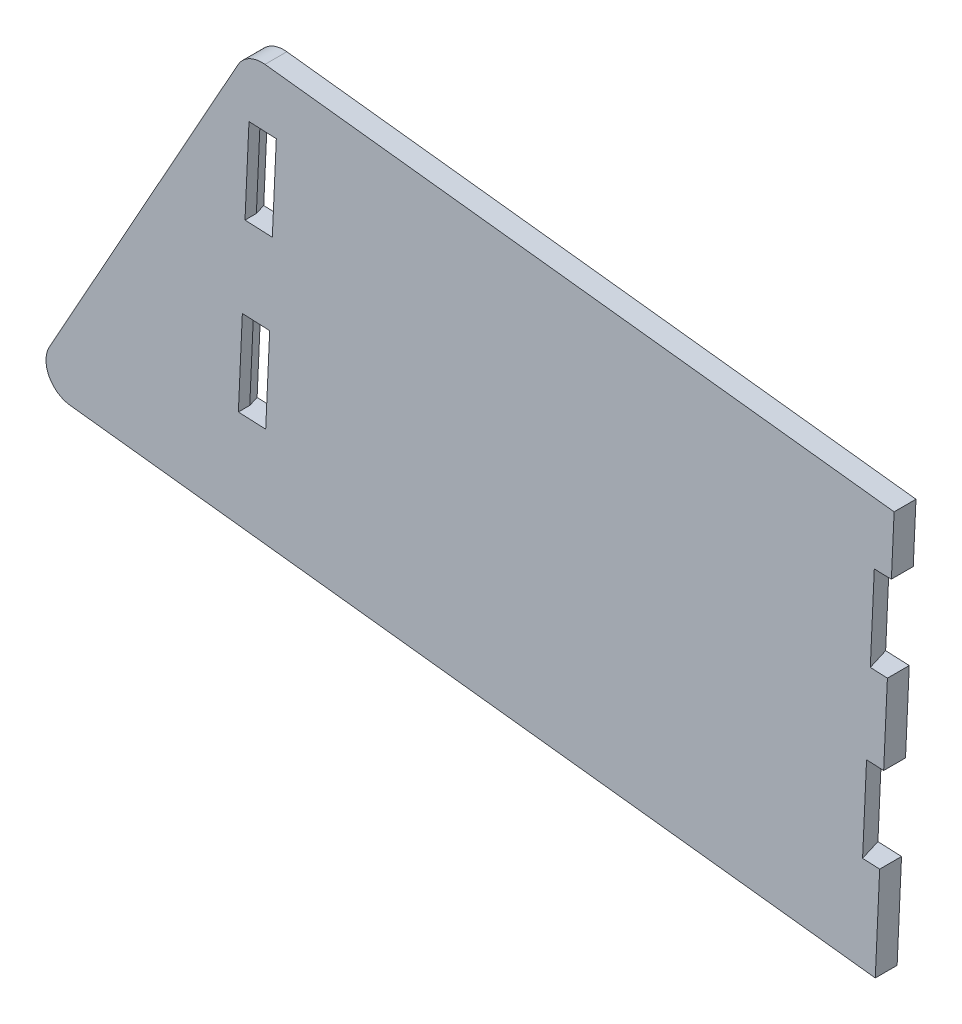
ISO-10303-21;
HEADER;
FILE_DESCRIPTION(('STEP AP214'),'2;1');
FILE_NAME('part.step','',(''),(''),'','','');
FILE_SCHEMA(('AUTOMOTIVE_DESIGN { 1 0 10303 214 1 1 1 1 }'));
ENDSEC;
DATA;
#1=APPLICATION_CONTEXT('core data for automotive mechanical design processes');
#2=APPLICATION_PROTOCOL_DEFINITION('international standard','automotive_design',2000,#1);
#3=PRODUCT_CONTEXT('',#1,'mechanical');
#4=PRODUCT('Part','Part','',(#3));
#5=PRODUCT_RELATED_PRODUCT_CATEGORY('part','',(#4));
#6=PRODUCT_DEFINITION_FORMATION('','',#4);
#7=PRODUCT_DEFINITION_CONTEXT('part definition',#1,'design');
#8=PRODUCT_DEFINITION('design','',#6,#7);
#9=PRODUCT_DEFINITION_SHAPE('','',#8);
#10=(LENGTH_UNIT() NAMED_UNIT(*) SI_UNIT(.MILLI.,.METRE.));
#11=(NAMED_UNIT(*) PLANE_ANGLE_UNIT() SI_UNIT($,.RADIAN.));
#12=(NAMED_UNIT(*) SI_UNIT($,.STERADIAN.) SOLID_ANGLE_UNIT());
#13=UNCERTAINTY_MEASURE_WITH_UNIT(LENGTH_MEASURE(1.E-05),#10,'distance_accuracy_value','');
#14=(GEOMETRIC_REPRESENTATION_CONTEXT(3) GLOBAL_UNCERTAINTY_ASSIGNED_CONTEXT((#13)) GLOBAL_UNIT_ASSIGNED_CONTEXT((#10,
#11,#12)) REPRESENTATION_CONTEXT('',''));
#15=CARTESIAN_POINT('',(0.,0.,0.));
#16=DIRECTION('',(0.,0.,1.));
#17=DIRECTION('',(1.,0.,0.));
#18=AXIS2_PLACEMENT_3D('',#15,#16,#17);
#19=CARTESIAN_POINT('',(118.450220219709,62.2675177030051,4.));
#20=DIRECTION('',(-0.998960218043437,0.045590380198122,0.));
#21=DIRECTION('',(-0.045590380198122,-0.998960218043437,0.));
#22=AXIS2_PLACEMENT_3D('',#19,#20,#21);
#23=PLANE('',#22);
#24=DIRECTION('',(0.045590380198122,0.998960218043437,0.));
#25=VECTOR('',#24,1.);
#26=CARTESIAN_POINT('',(118.450220219709,62.2675177030051,4.));
#27=LINE('',#26,#25);
#28=CARTESIAN_POINT('',(117.951983076814,51.350322392501,4.));
#29=VERTEX_POINT('',#28);
#30=CARTESIAN_POINT('',(118.450220219709,62.2675177030051,4.));
#31=VERTEX_POINT('',#30);
#32=EDGE_CURVE('E383',#29,#31,#27,.T.);
#33=ORIENTED_EDGE('',*,*,#32,.F.);
#34=DIRECTION('',(0.,0.,-1.));
#35=VECTOR('',#34,1.);
#36=CARTESIAN_POINT('',(117.951983076814,51.350322392501,4.));
#37=LINE('',#36,#35);
#38=CARTESIAN_POINT('',(117.951983076814,51.350322392501,0.));
#39=VERTEX_POINT('',#38);
#40=EDGE_CURVE('E287',#29,#39,#37,.T.);
#41=ORIENTED_EDGE('',*,*,#40,.T.);
#42=DIRECTION('',(0.045590380198122,0.998960218043437,0.));
#43=VECTOR('',#42,1.);
#44=CARTESIAN_POINT('',(118.450220219709,62.2675177030051,0.));
#45=LINE('',#44,#43);
#46=CARTESIAN_POINT('',(118.450220219709,62.2675177030051,0.));
#47=VERTEX_POINT('',#46);
#48=EDGE_CURVE('E397',#39,#47,#45,.T.);
#49=ORIENTED_EDGE('',*,*,#48,.T.);
#50=DIRECTION('',(0.,0.,-1.));
#51=VECTOR('',#50,1.);
#52=CARTESIAN_POINT('',(118.450220219709,62.2675177030051,4.));
#53=LINE('',#52,#51);
#54=EDGE_CURVE('E394',#31,#47,#53,.T.);
#55=ORIENTED_EDGE('',*,*,#54,.F.);
#56=EDGE_LOOP('',(#33,#41,#49,#55));
#57=FACE_BOUND('',#56,.T.);
#58=ADVANCED_FACE('F41',(#57),#23,.F.);
#59=CARTESIAN_POINT('',(116.535424251388,20.3111885451808,0.));
#60=VERTEX_POINT('',#59);
#61=CARTESIAN_POINT('',(117.219279954359,35.2955918158324,0.));
#62=VERTEX_POINT('',#61);
#63=EDGE_CURVE('E402',#60,#62,#45,.T.);
#64=ORIENTED_EDGE('',*,*,#63,.T.);
#65=DIRECTION('',(0.,0.,1.));
#66=VECTOR('',#65,1.);
#67=CARTESIAN_POINT('',(117.219279954359,35.2955918158324,4.));
#68=LINE('',#67,#66);
#69=CARTESIAN_POINT('',(117.219279954359,35.2955918158324,4.));
#70=VERTEX_POINT('',#69);
#71=EDGE_CURVE('E291',#62,#70,#68,.T.);
#72=ORIENTED_EDGE('',*,*,#71,.T.);
#73=CARTESIAN_POINT('',(116.535424251388,20.3111885451808,4.00000000000002));
#74=VERTEX_POINT('',#73);
#75=EDGE_CURVE('E390',#74,#70,#27,.T.);
#76=ORIENTED_EDGE('',*,*,#75,.F.);
#77=DIRECTION('',(0.,0.,-1.));
#78=VECTOR('',#77,1.);
#79=CARTESIAN_POINT('',(116.535424251388,20.3111885451808,4.));
#80=LINE('',#79,#78);
#81=EDGE_CURVE('E299',#74,#60,#80,.T.);
#82=ORIENTED_EDGE('',*,*,#81,.T.);
#83=EDGE_LOOP('',(#64,#72,#76,#82));
#84=FACE_BOUND('',#83,.T.);
#85=ADVANCED_FACE('F492',(#84),#23,.F.);
#86=CARTESIAN_POINT('',(115.,-13.3324822969949,4.));
#87=DIRECTION('',(0.115163266544701,0.993346577000572,0.));
#88=DIRECTION('',(-0.993346577000572,0.115163266544701,0.));
#89=AXIS2_PLACEMENT_3D('',#86,#87,#88);
#90=PLANE('',#89);
#91=DIRECTION('',(0.993346577000572,-0.115163266544701,0.));
#92=VECTOR('',#91,1.);
#93=CARTESIAN_POINT('',(115.,-13.3324822969949,4.));
#94=LINE('',#93,#92);
#95=CARTESIAN_POINT('',(-32.3236554516052,3.74743099202338,4.));
#96=VERTEX_POINT('',#95);
#97=CARTESIAN_POINT('',(115.,-13.3324822969949,4.));
#98=VERTEX_POINT('',#97);
#99=EDGE_CURVE('E380',#96,#98,#94,.T.);
#100=ORIENTED_EDGE('',*,*,#99,.F.);
#101=DIRECTION('',(0.,0.,1.));
#102=VECTOR('',#101,1.);
#103=CARTESIAN_POINT('',(-32.3236554516052,3.74743099202338,0.));
#104=LINE('',#103,#102);
#105=CARTESIAN_POINT('',(-32.3236554516052,3.74743099202338,0.));
#106=VERTEX_POINT('',#105);
#107=EDGE_CURVE('E11',#96,#106,#104,.F.);
#108=ORIENTED_EDGE('',*,*,#107,.T.);
#109=DIRECTION('',(0.993346577000572,-0.115163266544701,0.));
#110=VECTOR('',#109,1.);
#111=CARTESIAN_POINT('',(115.,-13.3324822969949,0.));
#112=LINE('',#111,#110);
#113=CARTESIAN_POINT('',(115.,-13.3324822969949,0.));
#114=VERTEX_POINT('',#113);
#115=EDGE_CURVE('E376',#106,#114,#112,.T.);
#116=ORIENTED_EDGE('',*,*,#115,.T.);
#117=DIRECTION('',(0.,0.,-1.));
#118=VECTOR('',#117,1.);
#119=CARTESIAN_POINT('',(115.,-13.3324822969949,4.));
#120=LINE('',#119,#118);
#121=EDGE_CURVE('E220',#98,#114,#120,.T.);
#122=ORIENTED_EDGE('',*,*,#121,.F.);
#123=EDGE_LOOP('',(#100,#108,#116,#122));
#124=FACE_BOUND('',#123,.T.);
#125=ADVANCED_FACE('F533',(#124),#90,.F.);
#126=CARTESIAN_POINT('',(115.805978168218,4.32782505648582,0.));
#127=VERTEX_POINT('',#126);
#128=EDGE_CURVE('E398',#114,#127,#45,.T.);
#129=ORIENTED_EDGE('',*,*,#128,.T.);
#130=DIRECTION('',(0.,0.,1.));
#131=VECTOR('',#130,1.);
#132=CARTESIAN_POINT('',(115.805978168218,4.32782505648582,4.));
#133=LINE('',#132,#131);
#134=CARTESIAN_POINT('',(115.805978168218,4.32782505648581,4.));
#135=VERTEX_POINT('',#134);
#136=EDGE_CURVE('E295',#127,#135,#133,.T.);
#137=ORIENTED_EDGE('',*,*,#136,.T.);
#138=EDGE_CURVE('E385',#98,#135,#27,.T.);
#139=ORIENTED_EDGE('',*,*,#138,.F.);
#140=ORIENTED_EDGE('',*,*,#121,.T.);
#141=EDGE_LOOP('',(#129,#137,#139,#140));
#142=FACE_BOUND('',#141,.T.);
#143=ADVANCED_FACE('F529',(#142),#23,.F.);
#144=CARTESIAN_POINT('',(0.,76.,4.));
#145=DIRECTION('',(-0.115163266544701,-0.993346577000572,0.));
#146=DIRECTION('',(0.993346577000572,-0.115163266544701,0.));
#147=AXIS2_PLACEMENT_3D('',#144,#145,#146);
#148=PLANE('',#147);
#149=DIRECTION('',(-0.993346577000572,0.115163266544701,0.));
#150=VECTOR('',#149,1.);
#151=CARTESIAN_POINT('',(0.,76.,0.));
#152=LINE('',#151,#150);
#153=CARTESIAN_POINT('',(3.31866481401019,75.6152518271091,0.));
#154=VERTEX_POINT('',#153);
#155=EDGE_CURVE('E384',#47,#154,#152,.T.);
#156=ORIENTED_EDGE('',*,*,#155,.T.);
#157=DIRECTION('',(0.,0.,-1.));
#158=VECTOR('',#157,1.);
#159=CARTESIAN_POINT('',(3.31866481401019,75.6152518271091,4.));
#160=LINE('',#159,#158);
#161=CARTESIAN_POINT('',(3.31866481401019,75.6152518271091,4.));
#162=VERTEX_POINT('',#161);
#163=EDGE_CURVE('E460',#154,#162,#160,.F.);
#164=ORIENTED_EDGE('',*,*,#163,.T.);
#165=DIRECTION('',(-0.993346577000572,0.115163266544701,0.));
#166=VECTOR('',#165,1.);
#167=CARTESIAN_POINT('',(0.,76.,4.));
#168=LINE('',#167,#166);
#169=EDGE_CURVE('E389',#31,#162,#168,.T.);
#170=ORIENTED_EDGE('',*,*,#169,.F.);
#171=ORIENTED_EDGE('',*,*,#54,.T.);
#172=EDGE_LOOP('',(#156,#164,#170,#171));
#173=FACE_BOUND('',#172,.T.);
#174=ADVANCED_FACE('F483',(#173),#148,.F.);
#175=CARTESIAN_POINT('',(0.,0.,4.));
#176=DIRECTION('',(0.,0.,1.));
#177=DIRECTION('',(1.,0.,0.));
#178=AXIS2_PLACEMENT_3D('',#175,#176,#177);
#179=PLANE('',#178);
#180=DIRECTION('',(0.998960218043437,-0.0455903801981211,0.));
#181=VECTOR('',#180,1.);
#182=CARTESIAN_POINT('',(2.23607545356897,48.9960911260593,4.));
#183=LINE('',#182,#181);
#184=CARTESIAN_POINT('',(-0.335303230023438,49.1134432785284,4.));
#185=VERTEX_POINT('',#184);
#186=CARTESIAN_POINT('',(4.66469676997656,48.8852541105582,4.));
#187=VERTEX_POINT('',#186);
#188=EDGE_CURVE('E338',#185,#187,#183,.T.);
#189=ORIENTED_EDGE('',*,*,#188,.F.);
#190=DIRECTION('',(-0.0455903801981216,-0.998960218043437,0.));
#191=VECTOR('',#190,1.);
#192=CARTESIAN_POINT('',(0.394142853146508,65.0968067672233,4.));
#193=LINE('',#192,#191);
#194=CARTESIAN_POINT('',(0.394142853146508,65.0968067672233,4.));
#195=VERTEX_POINT('',#194);
#196=EDGE_CURVE('E235',#195,#185,#193,.T.);
#197=ORIENTED_EDGE('',*,*,#196,.F.);
#198=DIRECTION('',(-0.998960218043437,0.0455903801981227,0.));
#199=VECTOR('',#198,1.);
#200=CARTESIAN_POINT('',(2.96552153673901,64.9794546147543,4.));
#201=LINE('',#200,#199);
#202=CARTESIAN_POINT('',(5.39414285314651,64.8686175992532,4.));
#203=VERTEX_POINT('',#202);
#204=EDGE_CURVE('E335',#203,#195,#201,.T.);
#205=ORIENTED_EDGE('',*,*,#204,.F.);
#206=DIRECTION('',(0.0455903801981219,0.998960218043437,0.));
#207=VECTOR('',#206,1.);
#208=CARTESIAN_POINT('',(2.42862131640755,-0.110837015501121,4.));
#209=LINE('',#208,#207);
#210=EDGE_CURVE('E227',#187,#203,#209,.T.);
#211=ORIENTED_EDGE('',*,*,#210,.F.);
#212=EDGE_LOOP('',(#189,#197,#205,#211));
#213=FACE_BOUND('',#212,.T.);
#214=DIRECTION('',(-0.0455903801981218,-0.998960218043437,0.));
#215=VECTOR('',#214,1.);
#216=CARTESIAN_POINT('',(-1.54747654987128,18.0910474194982,4.));
#217=LINE('',#216,#215);
#218=CARTESIAN_POINT('',(-0.818030466701336,34.0744109081932,4.));
#219=VERTEX_POINT('',#218);
#220=CARTESIAN_POINT('',(-1.54747654987128,18.0910474194982,4.));
#221=VERTEX_POINT('',#220);
#222=EDGE_CURVE('E257',#219,#221,#217,.T.);
#223=ORIENTED_EDGE('',*,*,#222,.F.);
#224=DIRECTION('',(-0.998960218043437,0.0455903801981227,0.));
#225=VECTOR('',#224,1.);
#226=CARTESIAN_POINT('',(1.55014982086465,33.9663322903086,4.));
#227=LINE('',#226,#225);
#228=CARTESIAN_POINT('',(4.18196953329866,33.846221740223,4.));
#229=VERTEX_POINT('',#228);
#230=EDGE_CURVE('E364',#229,#219,#227,.T.);
#231=ORIENTED_EDGE('',*,*,#230,.F.);
#232=DIRECTION('',(0.0455903801981219,0.998960218043437,0.));
#233=VECTOR('',#232,1.);
#234=CARTESIAN_POINT('',(2.63181971243405,-0.120110550085552,4.));
#235=LINE('',#234,#233);
#236=CARTESIAN_POINT('',(3.45252345012871,17.862858251528,4.));
#237=VERTEX_POINT('',#236);
#238=EDGE_CURVE('E360',#237,#229,#235,.T.);
#239=ORIENTED_EDGE('',*,*,#238,.F.);
#240=DIRECTION('',(0.998960218043437,-0.0455903801981219,0.));
#241=VECTOR('',#240,1.);
#242=CARTESIAN_POINT('',(0.820703737694667,17.9829688016136,4.));
#243=LINE('',#242,#241);
#244=EDGE_CURVE('E367',#221,#237,#243,.T.);
#245=ORIENTED_EDGE('',*,*,#244,.F.);
#246=EDGE_LOOP('',(#223,#231,#239,#245));
#247=FACE_BOUND('',#246,.T.);
#248=ORIENTED_EDGE('',*,*,#169,.T.);
#249=CARTESIAN_POINT('',(2.74284848128668,70.6485189421063,4.));
#250=DIRECTION('',(0.,0.,1.));
#251=DIRECTION('',(1.,0.,0.));
#252=AXIS2_PLACEMENT_3D('',#249,#250,#251);
#253=CIRCLE('',#252,5.);
#254=CARTESIAN_POINT('',(-1.62545900399967,73.0811902544687,4.));
#255=VERTEX_POINT('',#254);
#256=EDGE_CURVE('E50',#162,#255,#253,.T.);
#257=ORIENTED_EDGE('',*,*,#256,.T.);
#258=DIRECTION('',(-0.486534262472487,-0.873661497057272,0.));
#259=VECTOR('',#258,1.);
#260=CARTESIAN_POINT('',(-39.7568965089207,4.60920103381428,4.));
#261=LINE('',#260,#259);
#262=CARTESIAN_POINT('',(-36.1161466041681,11.1468351893887,4.));
#263=VERTEX_POINT('',#262);
#264=EDGE_CURVE('E371',#255,#263,#261,.T.);
#265=ORIENTED_EDGE('',*,*,#264,.T.);
#266=CARTESIAN_POINT('',(-31.7478391188817,8.71416387702624,4.));
#267=DIRECTION('',(0.,0.,1.));
#268=DIRECTION('',(1.,0.,0.));
#269=AXIS2_PLACEMENT_3D('',#266,#267,#268);
#270=CIRCLE('',#269,5.);
#271=EDGE_CURVE('E463',#263,#96,#270,.T.);
#272=ORIENTED_EDGE('',*,*,#271,.T.);
#273=ORIENTED_EDGE('',*,*,#99,.T.);
#274=ORIENTED_EDGE('',*,*,#138,.T.);
#275=DIRECTION('',(0.998960218043437,-0.0455903801981219,0.));
#276=VECTOR('',#275,1.);
#277=CARTESIAN_POINT('',(0.437802763193311,9.59297864766712,4.));
#278=LINE('',#277,#276);
#279=CARTESIAN_POINT('',(112.678437601392,4.47055923243316,4.));
#280=VERTEX_POINT('',#279);
#281=EDGE_CURVE('E348',#280,#135,#278,.T.);
#282=ORIENTED_EDGE('',*,*,#281,.F.);
#283=DIRECTION('',(-0.045590380198122,-0.998960218043437,0.));
#284=VECTOR('',#283,1.);
#285=CARTESIAN_POINT('',(112.240634838199,-5.12241941523397,4.));
#286=LINE('',#285,#284);
#287=CARTESIAN_POINT('',(113.407883684562,20.4539227211282,3.99999999999999));
#288=VERTEX_POINT('',#287);
#289=EDGE_CURVE('E345',#288,#280,#286,.T.);
#290=ORIENTED_EDGE('',*,*,#289,.F.);
#291=DIRECTION('',(-0.998960218043437,0.0455903801981221,0.));
#292=VECTOR('',#291,1.);
#293=CARTESIAN_POINT('',(1.16724884636327,25.5763421363621,4.));
#294=LINE('',#293,#292);
#295=EDGE_CURVE('E342',#74,#288,#294,.T.);
#296=ORIENTED_EDGE('',*,*,#295,.F.);
#297=ORIENTED_EDGE('',*,*,#75,.T.);
#298=DIRECTION('',(0.998960218043437,-0.0455903801981199,0.));
#299=VECTOR('',#298,1.);
#300=CARTESIAN_POINT('',(1.851104549335,40.5607454070134,4.));
#301=LINE('',#300,#299);
#302=CARTESIAN_POINT('',(114.091739387534,35.4383259917797,4.));
#303=VERTEX_POINT('',#302);
#304=EDGE_CURVE('E357',#303,#70,#301,.T.);
#305=ORIENTED_EDGE('',*,*,#304,.F.);
#306=DIRECTION('',(-0.045590380198122,-0.998960218043437,0.));
#307=VECTOR('',#306,1.);
#308=CARTESIAN_POINT('',(112.240634838199,-5.12241941523397,4.));
#309=LINE('',#308,#307);
#310=CARTESIAN_POINT('',(114.821185470704,51.4216894804747,4.));
#311=VERTEX_POINT('',#310);
#312=EDGE_CURVE('E354',#311,#303,#309,.T.);
#313=ORIENTED_EDGE('',*,*,#312,.F.);
#314=DIRECTION('',(-0.998960218043437,0.0455903801981199,0.));
#315=VECTOR('',#314,1.);
#316=CARTESIAN_POINT('',(2.58055063250492,56.5441088957084,4.));
#317=LINE('',#316,#315);
#318=CARTESIAN_POINT('',(116.384955754116,51.350322392501,4.));
#319=VERTEX_POINT('',#318);
#320=EDGE_CURVE('E351',#319,#311,#317,.T.);
#321=ORIENTED_EDGE('',*,*,#320,.F.);
#322=DIRECTION('',(-1.,0.,0.));
#323=VECTOR('',#322,1.);
#324=CARTESIAN_POINT('',(116.384955754117,51.350322392501,4.));
#325=LINE('',#324,#323);
#326=EDGE_CURVE('E276',#29,#319,#325,.T.);
#327=ORIENTED_EDGE('',*,*,#326,.F.);
#328=ORIENTED_EDGE('',*,*,#32,.T.);
#329=EDGE_LOOP('',(#248,#257,#265,#272,#273,#274,#282,#290,#296,#297,#305,#313,#321,#327,#328));
#330=FACE_BOUND('',#329,.T.);
#331=ADVANCED_FACE('F469',(#213,#247,#330),#179,.T.);
#332=CARTESIAN_POINT('',(0.,0.,0.));
#333=DIRECTION('',(0.,0.,1.));
#334=DIRECTION('',(1.,0.,0.));
#335=AXIS2_PLACEMENT_3D('',#332,#333,#334);
#336=PLANE('',#335);
#337=DIRECTION('',(0.0455903801981219,0.998960218043437,0.));
#338=VECTOR('',#337,1.);
#339=CARTESIAN_POINT('',(4.18196953329866,33.846221740223,0.));
#340=LINE('',#339,#338);
#341=CARTESIAN_POINT('',(3.45252345012871,17.862858251528,0.));
#342=VERTEX_POINT('',#341);
#343=CARTESIAN_POINT('',(4.18196953329866,33.846221740223,0.));
#344=VERTEX_POINT('',#343);
#345=EDGE_CURVE('E252',#342,#344,#340,.T.);
#346=ORIENTED_EDGE('',*,*,#345,.T.);
#347=DIRECTION('',(-0.998960218043437,0.0455903801981227,0.));
#348=VECTOR('',#347,1.);
#349=CARTESIAN_POINT('',(1.55014982086465,33.9663322903086,0.));
#350=LINE('',#349,#348);
#351=CARTESIAN_POINT('',(-1.38931808919179,34.1004832376427,0.));
#352=VERTEX_POINT('',#351);
#353=EDGE_CURVE('E436',#344,#352,#350,.T.);
#354=ORIENTED_EDGE('',*,*,#353,.T.);
#355=DIRECTION('',(-0.045590380198122,-0.998960218043437,0.));
#356=VECTOR('',#355,1.);
#357=CARTESIAN_POINT('',(-2.93946791005642,0.134150947334145,0.));
#358=LINE('',#357,#356);
#359=CARTESIAN_POINT('',(-2.11876417236175,18.1171197489477,0.));
#360=VERTEX_POINT('',#359);
#361=EDGE_CURVE('E439',#352,#360,#358,.T.);
#362=ORIENTED_EDGE('',*,*,#361,.T.);
#363=DIRECTION('',(0.998960218043437,-0.0455903801981219,0.));
#364=VECTOR('',#363,1.);
#365=CARTESIAN_POINT('',(0.820703737694667,17.9829688016136,0.));
#366=LINE('',#365,#364);
#367=EDGE_CURVE('E443',#360,#342,#366,.T.);
#368=ORIENTED_EDGE('',*,*,#367,.T.);
#369=EDGE_LOOP('',(#346,#354,#362,#368));
#370=FACE_BOUND('',#369,.T.);
#371=DIRECTION('',(-0.486534262472487,-0.873661497057272,0.));
#372=VECTOR('',#371,1.);
#373=CARTESIAN_POINT('',(-39.7568965089207,4.60920103381428,0.));
#374=LINE('',#373,#372);
#375=CARTESIAN_POINT('',(-1.62545900399967,73.0811902544687,0.));
#376=VERTEX_POINT('',#375);
#377=CARTESIAN_POINT('',(-36.1161466041681,11.1468351893887,0.));
#378=VERTEX_POINT('',#377);
#379=EDGE_CURVE('E372',#376,#378,#374,.T.);
#380=ORIENTED_EDGE('',*,*,#379,.F.);
#381=CARTESIAN_POINT('',(2.74284848128668,70.6485189421063,0.));
#382=DIRECTION('',(0.,0.,1.));
#383=DIRECTION('',(1.,0.,0.));
#384=AXIS2_PLACEMENT_3D('',#381,#382,#383);
#385=CIRCLE('',#384,5.);
#386=EDGE_CURVE('E457',#376,#154,#385,.F.);
#387=ORIENTED_EDGE('',*,*,#386,.T.);
#388=ORIENTED_EDGE('',*,*,#155,.F.);
#389=ORIENTED_EDGE('',*,*,#48,.F.);
#390=DIRECTION('',(-1.,0.,0.));
#391=VECTOR('',#390,1.);
#392=CARTESIAN_POINT('',(116.384955754117,51.350322392501,0.));
#393=LINE('',#392,#391);
#394=CARTESIAN_POINT('',(116.384955754117,51.350322392501,0.));
#395=VERTEX_POINT('',#394);
#396=EDGE_CURVE('E277',#39,#395,#393,.T.);
#397=ORIENTED_EDGE('',*,*,#396,.T.);
#398=DIRECTION('',(-0.998960218043437,0.0455903801981199,0.));
#399=VECTOR('',#398,1.);
#400=CARTESIAN_POINT('',(2.58055063250492,56.5441088957084,0.));
#401=LINE('',#400,#399);
#402=CARTESIAN_POINT('',(113.628454641769,51.4761231315681,0.));
#403=VERTEX_POINT('',#402);
#404=EDGE_CURVE('E426',#395,#403,#401,.T.);
#405=ORIENTED_EDGE('',*,*,#404,.T.);
#406=DIRECTION('',(-0.045590380198122,-0.998960218043437,0.));
#407=VECTOR('',#406,1.);
#408=CARTESIAN_POINT('',(111.047904009264,-5.06798576414058,0.));
#409=LINE('',#408,#407);
#410=CARTESIAN_POINT('',(112.899008558599,35.4927596428731,0.));
#411=VERTEX_POINT('',#410);
#412=EDGE_CURVE('E429',#403,#411,#409,.T.);
#413=ORIENTED_EDGE('',*,*,#412,.T.);
#414=DIRECTION('',(0.998960218043437,-0.0455903801981199,0.));
#415=VECTOR('',#414,1.);
#416=CARTESIAN_POINT('',(1.851104549335,40.5607454070134,0.));
#417=LINE('',#416,#415);
#418=EDGE_CURVE('E433',#411,#62,#417,.T.);
#419=ORIENTED_EDGE('',*,*,#418,.T.);
#420=ORIENTED_EDGE('',*,*,#63,.F.);
#421=DIRECTION('',(-0.998960218043437,0.0455903801981221,0.));
#422=VECTOR('',#421,1.);
#423=CARTESIAN_POINT('',(1.16724884636327,25.5763421363621,0.));
#424=LINE('',#423,#422);
#425=CARTESIAN_POINT('',(112.215152855627,20.5083563722215,0.));
#426=VERTEX_POINT('',#425);
#427=EDGE_CURVE('E416',#60,#426,#424,.T.);
#428=ORIENTED_EDGE('',*,*,#427,.T.);
#429=DIRECTION('',(-0.045590380198122,-0.998960218043437,0.));
#430=VECTOR('',#429,1.);
#431=CARTESIAN_POINT('',(111.047904009264,-5.06798576414058,0.));
#432=LINE('',#431,#430);
#433=CARTESIAN_POINT('',(111.485706772457,4.52499288352655,0.));
#434=VERTEX_POINT('',#433);
#435=EDGE_CURVE('E419',#426,#434,#432,.T.);
#436=ORIENTED_EDGE('',*,*,#435,.T.);
#437=DIRECTION('',(0.998960218043437,-0.0455903801981219,0.));
#438=VECTOR('',#437,1.);
#439=CARTESIAN_POINT('',(0.437802763193311,9.59297864766712,0.));
#440=LINE('',#439,#438);
#441=EDGE_CURVE('E423',#434,#127,#440,.T.);
#442=ORIENTED_EDGE('',*,*,#441,.T.);
#443=ORIENTED_EDGE('',*,*,#128,.F.);
#444=ORIENTED_EDGE('',*,*,#115,.F.);
#445=CARTESIAN_POINT('',(-31.7478391188817,8.71416387702624,0.));
#446=DIRECTION('',(0.,0.,1.));
#447=DIRECTION('',(1.,0.,0.));
#448=AXIS2_PLACEMENT_3D('',#445,#446,#447);
#449=CIRCLE('',#448,5.);
#450=EDGE_CURVE('E454',#106,#378,#449,.F.);
#451=ORIENTED_EDGE('',*,*,#450,.T.);
#452=EDGE_LOOP('',(#380,#387,#388,#389,#397,#405,#413,#419,#420,#428,#436,#442,#443,#444,#451));
#453=FACE_BOUND('',#452,.T.);
#454=DIRECTION('',(0.998960218043437,-0.0455903801981211,0.));
#455=VECTOR('',#454,1.);
#456=CARTESIAN_POINT('',(2.23607545356897,48.9960911260593,0.));
#457=LINE('',#456,#455);
#458=CARTESIAN_POINT('',(-0.906590852513903,49.1395156079779,0.));
#459=VERTEX_POINT('',#458);
#460=CARTESIAN_POINT('',(4.66469676997656,48.8852541105582,0.));
#461=VERTEX_POINT('',#460);
#462=EDGE_CURVE('E232',#459,#461,#457,.T.);
#463=ORIENTED_EDGE('',*,*,#462,.T.);
#464=DIRECTION('',(0.0455903801981219,0.998960218043437,0.));
#465=VECTOR('',#464,1.);
#466=CARTESIAN_POINT('',(4.66469676997656,48.8852541105582,0.));
#467=LINE('',#466,#465);
#468=CARTESIAN_POINT('',(5.39414285314651,64.8686175992532,0.));
#469=VERTEX_POINT('',#468);
#470=EDGE_CURVE('E225',#461,#469,#467,.T.);
#471=ORIENTED_EDGE('',*,*,#470,.T.);
#472=DIRECTION('',(-0.998960218043437,0.0455903801981227,0.));
#473=VECTOR('',#472,1.);
#474=CARTESIAN_POINT('',(2.96552153673901,64.9794546147543,0.));
#475=LINE('',#474,#473);
#476=CARTESIAN_POINT('',(-0.177144769343951,65.1228790966729,0.));
#477=VERTEX_POINT('',#476);
#478=EDGE_CURVE('E207',#469,#477,#475,.T.);
#479=ORIENTED_EDGE('',*,*,#478,.T.);
#480=DIRECTION('',(-0.045590380198122,-0.998960218043437,0.));
#481=VECTOR('',#480,1.);
#482=CARTESIAN_POINT('',(-3.14266630608291,0.143424481918576,0.));
#483=LINE('',#482,#481);
#484=EDGE_CURVE('E219',#477,#459,#483,.T.);
#485=ORIENTED_EDGE('',*,*,#484,.T.);
#486=EDGE_LOOP('',(#463,#471,#479,#485));
#487=FACE_BOUND('',#486,.T.);
#488=ADVANCED_FACE('F231',(#370,#453,#487),#336,.F.);
#489=CARTESIAN_POINT('',(-39.7568965089207,4.60920103381428,0.));
#490=DIRECTION('',(-0.873661497057272,0.486534262472487,0.));
#491=DIRECTION('',(-0.486534262472487,-0.873661497057272,0.));
#492=AXIS2_PLACEMENT_3D('',#489,#490,#491);
#493=PLANE('',#492);
#494=ORIENTED_EDGE('',*,*,#264,.F.);
#495=DIRECTION('',(0.,0.,-1.));
#496=VECTOR('',#495,1.);
#497=CARTESIAN_POINT('',(-1.62545900399967,73.0811902544687,0.));
#498=LINE('',#497,#496);
#499=EDGE_CURVE('E450',#255,#376,#498,.T.);
#500=ORIENTED_EDGE('',*,*,#499,.T.);
#501=ORIENTED_EDGE('',*,*,#379,.T.);
#502=DIRECTION('',(0.,0.,1.));
#503=VECTOR('',#502,1.);
#504=CARTESIAN_POINT('',(-36.1161466041681,11.1468351893887,4.));
#505=LINE('',#504,#503);
#506=EDGE_CURVE('E446',#378,#263,#505,.T.);
#507=ORIENTED_EDGE('',*,*,#506,.T.);
#508=EDGE_LOOP('',(#494,#500,#501,#507));
#509=FACE_BOUND('',#508,.T.);
#510=ADVANCED_FACE('F475',(#509),#493,.T.);
#511=CARTESIAN_POINT('',(-0.158019075679196,49.1053524137935,-12.1736939422054));
#512=DIRECTION('',(-0.0455903801981211,-0.998960218043437,0.));
#513=DIRECTION('',(0.998960218043437,-0.0455903801981211,0.));
#514=AXIS2_PLACEMENT_3D('',#511,#512,#513);
#515=PLANE('',#514);
#516=DIRECTION('',(0.285725466260487,-0.0130398912827727,0.958222792029892));
#517=VECTOR('',#516,1.);
#518=CARTESIAN_POINT('',(-4.17837016257276,49.2888325276868,-10.9723978979601));
#519=LINE('',#518,#517);
#520=CARTESIAN_POINT('',(-0.335303230023438,49.1134432785284,1.91589789961481));
#521=VERTEX_POINT('',#520);
#522=EDGE_CURVE('E327',#459,#521,#519,.T.);
#523=ORIENTED_EDGE('',*,*,#522,.T.);
#524=DIRECTION('',(0.,0.,1.));
#525=VECTOR('',#524,1.);
#526=CARTESIAN_POINT('',(-0.335303230023438,49.1134432785284,0.));
#527=LINE('',#526,#525);
#528=EDGE_CURVE('E246',#521,#185,#527,.T.);
#529=ORIENTED_EDGE('',*,*,#528,.T.);
#530=ORIENTED_EDGE('',*,*,#188,.T.);
#531=DIRECTION('',(0.,0.,1.));
#532=VECTOR('',#531,1.);
#533=CARTESIAN_POINT('',(4.66469676997656,48.8852541105582,0.));
#534=LINE('',#533,#532);
#535=EDGE_CURVE('E242',#461,#187,#534,.T.);
#536=ORIENTED_EDGE('',*,*,#535,.F.);
#537=ORIENTED_EDGE('',*,*,#462,.F.);
#538=EDGE_LOOP('',(#523,#529,#530,#536,#537));
#539=FACE_BOUND('',#538,.T.);
#540=ADVANCED_FACE('F623',(#539),#515,.F.);
#541=CARTESIAN_POINT('',(-4.17837016257276,49.2888325276868,-10.9723978979601));
#542=DIRECTION('',(-0.957226449260371,0.0436857414031488,0.286022867677463));
#543=DIRECTION('',(0.286296188265636,0.,0.958141165269799));
#544=AXIS2_PLACEMENT_3D('',#541,#542,#543);
#545=PLANE('',#544);
#546=DIRECTION('',(0.285725466260487,-0.0130398912827727,0.958222792029892));
#547=VECTOR('',#546,1.);
#548=CARTESIAN_POINT('',(-3.44892407940281,65.2721960163817,-10.9723978979601));
#549=LINE('',#548,#547);
#550=CARTESIAN_POINT('',(0.394142853146507,65.0968067672233,1.9158978996148));
#551=VERTEX_POINT('',#550);
#552=EDGE_CURVE('E213',#477,#551,#549,.T.);
#553=ORIENTED_EDGE('',*,*,#552,.T.);
#554=DIRECTION('',(-0.0455903801981217,-0.998960218043437,0.));
#555=VECTOR('',#554,1.);
#556=CARTESIAN_POINT('',(-0.335303230023438,49.1134432785284,1.91589789961482));
#557=LINE('',#556,#555);
#558=EDGE_CURVE('E272',#551,#521,#557,.T.);
#559=ORIENTED_EDGE('',*,*,#558,.T.);
#560=ORIENTED_EDGE('',*,*,#522,.F.);
#561=ORIENTED_EDGE('',*,*,#484,.F.);
#562=EDGE_LOOP('',(#553,#559,#560,#561));
#563=FACE_BOUND('',#562,.T.);
#564=ADVANCED_FACE('F626',(#563),#545,.F.);
#565=CARTESIAN_POINT('',(-3.44892407940281,65.2721960163817,-10.9723978979601));
#566=DIRECTION('',(0.0455903801981227,0.998960218043437,0.));
#567=DIRECTION('',(-0.998960218043437,0.0455903801981227,0.));
#568=AXIS2_PLACEMENT_3D('',#565,#566,#567);
#569=PLANE('',#568);
#570=ORIENTED_EDGE('',*,*,#552,.F.);
#571=ORIENTED_EDGE('',*,*,#478,.F.);
#572=DIRECTION('',(0.,0.,1.));
#573=VECTOR('',#572,1.);
#574=CARTESIAN_POINT('',(5.39414285314651,64.8686175992532,0.));
#575=LINE('',#574,#573);
#576=EDGE_CURVE('E210',#469,#203,#575,.T.);
#577=ORIENTED_EDGE('',*,*,#576,.T.);
#578=ORIENTED_EDGE('',*,*,#204,.T.);
#579=DIRECTION('',(0.,0.,1.));
#580=VECTOR('',#579,1.);
#581=CARTESIAN_POINT('',(0.394142853146508,65.0968067672233,0.));
#582=LINE('',#581,#580);
#583=EDGE_CURVE('E57',#551,#195,#582,.T.);
#584=ORIENTED_EDGE('',*,*,#583,.F.);
#585=EDGE_LOOP('',(#570,#571,#577,#578,#584));
#586=FACE_BOUND('',#585,.T.);
#587=ADVANCED_FACE('F209',(#586),#569,.F.);
#588=CARTESIAN_POINT('',(101.743781212721,4.96959326110724,-43.1596662528009));
#589=DIRECTION('',(-0.0455903801981219,-0.998960218043437,0.));
#590=DIRECTION('',(0.998960218043437,-0.0455903801981219,0.));
#591=AXIS2_PLACEMENT_3D('',#588,#589,#590);
#592=PLANE('',#591);
#593=ORIENTED_EDGE('',*,*,#281,.T.);
#594=ORIENTED_EDGE('',*,*,#136,.F.);
#595=ORIENTED_EDGE('',*,*,#441,.F.);
#596=DIRECTION('',(0.285725466260487,-0.0130398912827727,0.958222792029892));
#597=VECTOR('',#596,1.);
#598=CARTESIAN_POINT('',(98.8721018649396,5.10065048531669,-42.3015976497685));
#599=LINE('',#598,#597);
#600=EDGE_CURVE('E304',#434,#280,#599,.T.);
#601=ORIENTED_EDGE('',*,*,#600,.T.);
#602=EDGE_LOOP('',(#593,#594,#595,#601));
#603=FACE_BOUND('',#602,.T.);
#604=ADVANCED_FACE('F552',(#603),#592,.F.);
#605=CARTESIAN_POINT('',(98.8721018649396,5.10065048531669,-42.3015976497685));
#606=DIRECTION('',(-0.957226449260371,0.0436857414031487,0.286022867677463));
#607=DIRECTION('',(0.286296188265636,0.,0.958141165269799));
#608=AXIS2_PLACEMENT_3D('',#605,#606,#607);
#609=PLANE('',#608);
#610=ORIENTED_EDGE('',*,*,#289,.T.);
#611=ORIENTED_EDGE('',*,*,#600,.F.);
#612=ORIENTED_EDGE('',*,*,#435,.F.);
#613=DIRECTION('',(0.285725466260487,-0.0130398912827727,0.958222792029892));
#614=VECTOR('',#613,1.);
#615=CARTESIAN_POINT('',(99.6015479481095,21.0840139740117,-42.3015976497685));
#616=LINE('',#615,#614);
#617=EDGE_CURVE('E303',#426,#288,#616,.T.);
#618=ORIENTED_EDGE('',*,*,#617,.T.);
#619=EDGE_LOOP('',(#610,#611,#612,#618));
#620=FACE_BOUND('',#619,.T.);
#621=ADVANCED_FACE('F581',(#620),#609,.F.);
#622=CARTESIAN_POINT('',(99.6015479481095,21.0840139740117,-42.3015976497685));
#623=DIRECTION('',(0.0455903801981221,0.998960218043437,0.));
#624=DIRECTION('',(-0.998960218043437,0.0455903801981221,0.));
#625=AXIS2_PLACEMENT_3D('',#622,#623,#624);
#626=PLANE('',#625);
#627=ORIENTED_EDGE('',*,*,#617,.F.);
#628=ORIENTED_EDGE('',*,*,#427,.F.);
#629=ORIENTED_EDGE('',*,*,#81,.F.);
#630=ORIENTED_EDGE('',*,*,#295,.T.);
#631=EDGE_LOOP('',(#627,#628,#629,#630));
#632=FACE_BOUND('',#631,.T.);
#633=ADVANCED_FACE('F525',(#632),#626,.F.);
#634=CARTESIAN_POINT('',(100.285403651081,36.0684172446632,-42.3015976497685));
#635=DIRECTION('',(-0.0455903801981199,-0.998960218043437,0.));
#636=DIRECTION('',(0.998960218043437,-0.0455903801981199,0.));
#637=AXIS2_PLACEMENT_3D('',#634,#635,#636);
#638=PLANE('',#637);
#639=ORIENTED_EDGE('',*,*,#304,.T.);
#640=ORIENTED_EDGE('',*,*,#71,.F.);
#641=ORIENTED_EDGE('',*,*,#418,.F.);
#642=DIRECTION('',(0.285725466260487,-0.0130398912827727,0.958222792029892));
#643=VECTOR('',#642,1.);
#644=CARTESIAN_POINT('',(100.285403651081,36.0684172446632,-42.3015976497685));
#645=LINE('',#644,#643);
#646=EDGE_CURVE('E320',#411,#303,#645,.T.);
#647=ORIENTED_EDGE('',*,*,#646,.T.);
#648=EDGE_LOOP('',(#639,#640,#641,#647));
#649=FACE_BOUND('',#648,.T.);
#650=ADVANCED_FACE('F500',(#649),#638,.F.);
#651=CARTESIAN_POINT('',(101.014849734251,52.0517807333582,-42.3015976497685));
#652=DIRECTION('',(-0.957226449260371,0.0436857414031487,0.286022867677463));
#653=DIRECTION('',(0.286296188265636,0.,0.958141165269799));
#654=AXIS2_PLACEMENT_3D('',#651,#652,#653);
#655=PLANE('',#654);
#656=ORIENTED_EDGE('',*,*,#312,.T.);
#657=ORIENTED_EDGE('',*,*,#646,.F.);
#658=ORIENTED_EDGE('',*,*,#412,.F.);
#659=DIRECTION('',(0.285725466260487,-0.0130398912827727,0.958222792029892));
#660=VECTOR('',#659,1.);
#661=CARTESIAN_POINT('',(101.014849734251,52.0517807333582,-42.3015976497685));
#662=LINE('',#661,#660);
#663=EDGE_CURVE('E308',#403,#311,#662,.T.);
#664=ORIENTED_EDGE('',*,*,#663,.T.);
#665=EDGE_LOOP('',(#656,#657,#658,#664));
#666=FACE_BOUND('',#665,.T.);
#667=ADVANCED_FACE('F516',(#666),#655,.F.);
#668=CARTESIAN_POINT('',(103.886529082032,51.9207235091488,-43.1596662528009));
#669=DIRECTION('',(0.0455903801981199,0.998960218043437,0.));
#670=DIRECTION('',(-0.998960218043437,0.0455903801981199,0.));
#671=AXIS2_PLACEMENT_3D('',#668,#669,#670);
#672=PLANE('',#671);
#673=ORIENTED_EDGE('',*,*,#404,.F.);
#674=DIRECTION('',(0.,0.,1.));
#675=VECTOR('',#674,1.);
#676=CARTESIAN_POINT('',(116.384955754117,51.350322392501,0.));
#677=LINE('',#676,#675);
#678=EDGE_CURVE('E281',#395,#319,#677,.T.);
#679=ORIENTED_EDGE('',*,*,#678,.T.);
#680=ORIENTED_EDGE('',*,*,#320,.T.);
#681=ORIENTED_EDGE('',*,*,#663,.F.);
#682=EDGE_LOOP('',(#673,#679,#680,#681));
#683=FACE_BOUND('',#682,.T.);
#684=ADVANCED_FACE('F513',(#683),#672,.F.);
#685=CARTESIAN_POINT('',(-1.386815869533,18.0837152141038,-12.2294432314924));
#686=DIRECTION('',(-0.0455903801981219,-0.998960218043437,0.));
#687=DIRECTION('',(0.998960218043437,-0.0455903801981219,0.));
#688=AXIS2_PLACEMENT_3D('',#685,#686,#687);
#689=PLANE('',#688);
#690=DIRECTION('',(0.285725466260487,-0.0130398912827727,0.958222792029892));
#691=VECTOR('',#690,1.);
#692=CARTESIAN_POINT('',(-5.40716695642656,18.267195327997,-11.0281471872471));
#693=LINE('',#692,#691);
#694=CARTESIAN_POINT('',(-1.54747654987128,18.0910474194982,1.91589789961481));
#695=VERTEX_POINT('',#694);
#696=EDGE_CURVE('E312',#360,#695,#693,.T.);
#697=ORIENTED_EDGE('',*,*,#696,.T.);
#698=DIRECTION('',(0.,0.,1.));
#699=VECTOR('',#698,1.);
#700=CARTESIAN_POINT('',(-1.54747654987128,18.0910474194982,0.));
#701=LINE('',#700,#699);
#702=EDGE_CURVE('E65',#695,#221,#701,.T.);
#703=ORIENTED_EDGE('',*,*,#702,.T.);
#704=ORIENTED_EDGE('',*,*,#244,.T.);
#705=DIRECTION('',(0.,0.,1.));
#706=VECTOR('',#705,1.);
#707=CARTESIAN_POINT('',(3.45252345012871,17.862858251528,0.));
#708=LINE('',#707,#706);
#709=EDGE_CURVE('E262',#342,#237,#708,.T.);
#710=ORIENTED_EDGE('',*,*,#709,.F.);
#711=ORIENTED_EDGE('',*,*,#367,.F.);
#712=EDGE_LOOP('',(#697,#703,#704,#710,#711));
#713=FACE_BOUND('',#712,.T.);
#714=ADVANCED_FACE('F523',(#713),#689,.F.);
#715=CARTESIAN_POINT('',(-5.40716695642656,18.267195327997,-11.0281471872471));
#716=DIRECTION('',(-0.957226449260371,0.0436857414031487,0.286022867677463));
#717=DIRECTION('',(0.286296188265636,0.,0.958141165269799));
#718=AXIS2_PLACEMENT_3D('',#715,#716,#717);
#719=PLANE('',#718);
#720=DIRECTION('',(0.285725466260487,-0.0130398912827727,0.958222792029892));
#721=VECTOR('',#720,1.);
#722=CARTESIAN_POINT('',(-4.67772087325661,34.250558816692,-11.0281471872471));
#723=LINE('',#722,#721);
#724=CARTESIAN_POINT('',(-0.818030466701336,34.0744109081932,1.9158978996148));
#725=VERTEX_POINT('',#724);
#726=EDGE_CURVE('E316',#352,#725,#723,.T.);
#727=ORIENTED_EDGE('',*,*,#726,.T.);
#728=DIRECTION('',(-0.0455903801981218,-0.998960218043437,0.));
#729=VECTOR('',#728,1.);
#730=CARTESIAN_POINT('',(-1.54747654987128,18.0910474194982,1.91589789961481));
#731=LINE('',#730,#729);
#732=EDGE_CURVE('E245',#725,#695,#731,.T.);
#733=ORIENTED_EDGE('',*,*,#732,.T.);
#734=ORIENTED_EDGE('',*,*,#696,.F.);
#735=ORIENTED_EDGE('',*,*,#361,.F.);
#736=EDGE_LOOP('',(#727,#733,#734,#735));
#737=FACE_BOUND('',#736,.T.);
#738=ADVANCED_FACE('F574',(#737),#719,.F.);
#739=CARTESIAN_POINT('',(-4.67772087325661,34.250558816692,-11.0281471872471));
#740=DIRECTION('',(0.0455903801981227,0.998960218043437,0.));
#741=DIRECTION('',(-0.998960218043437,0.0455903801981227,0.));
#742=AXIS2_PLACEMENT_3D('',#739,#740,#741);
#743=PLANE('',#742);
#744=ORIENTED_EDGE('',*,*,#726,.F.);
#745=ORIENTED_EDGE('',*,*,#353,.F.);
#746=DIRECTION('',(0.,0.,1.));
#747=VECTOR('',#746,1.);
#748=CARTESIAN_POINT('',(4.18196953329866,33.846221740223,0.));
#749=LINE('',#748,#747);
#750=EDGE_CURVE('E239',#344,#229,#749,.T.);
#751=ORIENTED_EDGE('',*,*,#750,.T.);
#752=ORIENTED_EDGE('',*,*,#230,.T.);
#753=DIRECTION('',(0.,0.,1.));
#754=VECTOR('',#753,1.);
#755=CARTESIAN_POINT('',(-0.818030466701336,34.0744109081932,0.));
#756=LINE('',#755,#754);
#757=EDGE_CURVE('E256',#725,#219,#756,.T.);
#758=ORIENTED_EDGE('',*,*,#757,.F.);
#759=EDGE_LOOP('',(#744,#745,#751,#752,#758));
#760=FACE_BOUND('',#759,.T.);
#761=ADVANCED_FACE('F569',(#760),#743,.F.);
#762=CARTESIAN_POINT('',(116.384955754117,51.350322392501,0.));
#763=DIRECTION('',(0.,1.,0.));
#764=DIRECTION('',(-1.,0.,0.));
#765=AXIS2_PLACEMENT_3D('',#762,#763,#764);
#766=PLANE('',#765);
#767=ORIENTED_EDGE('',*,*,#326,.T.);
#768=ORIENTED_EDGE('',*,*,#678,.F.);
#769=ORIENTED_EDGE('',*,*,#396,.F.);
#770=ORIENTED_EDGE('',*,*,#40,.F.);
#771=EDGE_LOOP('',(#767,#768,#769,#770));
#772=FACE_BOUND('',#771,.T.);
#773=ADVANCED_FACE('F510',(#772),#766,.F.);
#774=CARTESIAN_POINT('',(2.74284848128668,70.6485189421063,0.));
#775=DIRECTION('',(0.,0.,1.));
#776=DIRECTION('',(1.,0.,0.));
#777=AXIS2_PLACEMENT_3D('',#774,#775,#776);
#778=CYLINDRICAL_SURFACE('',#777,5.);
#779=ORIENTED_EDGE('',*,*,#256,.F.);
#780=ORIENTED_EDGE('',*,*,#163,.F.);
#781=ORIENTED_EDGE('',*,*,#386,.F.);
#782=ORIENTED_EDGE('',*,*,#499,.F.);
#783=EDGE_LOOP('',(#779,#780,#781,#782));
#784=FACE_BOUND('',#783,.T.);
#785=ADVANCED_FACE('F478',(#784),#778,.T.);
#786=CARTESIAN_POINT('',(-31.7478391188817,8.71416387702624,0.));
#787=DIRECTION('',(0.,0.,-1.));
#788=DIRECTION('',(-1.,0.,0.));
#789=AXIS2_PLACEMENT_3D('',#786,#787,#788);
#790=CYLINDRICAL_SURFACE('',#789,5.);
#791=ORIENTED_EDGE('',*,*,#450,.F.);
#792=ORIENTED_EDGE('',*,*,#107,.F.);
#793=ORIENTED_EDGE('',*,*,#271,.F.);
#794=ORIENTED_EDGE('',*,*,#506,.F.);
#795=EDGE_LOOP('',(#791,#792,#793,#794));
#796=FACE_BOUND('',#795,.T.);
#797=ADVANCED_FACE('F43',(#796),#790,.T.);
#798=CARTESIAN_POINT('',(4.18196953329866,33.846221740223,0.));
#799=DIRECTION('',(0.998960218043437,-0.0455903801981219,0.));
#800=DIRECTION('',(0.0455903801981219,0.998960218043437,0.));
#801=AXIS2_PLACEMENT_3D('',#798,#799,#800);
#802=PLANE('',#801);
#803=ORIENTED_EDGE('',*,*,#238,.T.);
#804=ORIENTED_EDGE('',*,*,#750,.F.);
#805=ORIENTED_EDGE('',*,*,#345,.F.);
#806=ORIENTED_EDGE('',*,*,#709,.T.);
#807=EDGE_LOOP('',(#803,#804,#805,#806));
#808=FACE_BOUND('',#807,.T.);
#809=ADVANCED_FACE('F558',(#808),#802,.F.);
#810=CARTESIAN_POINT('',(-1.54747654987128,18.0910474194982,0.));
#811=DIRECTION('',(-0.998960218043437,0.0455903801981218,0.));
#812=DIRECTION('',(-0.0455903801981218,-0.998960218043437,0.));
#813=AXIS2_PLACEMENT_3D('',#810,#811,#812);
#814=PLANE('',#813);
#815=ORIENTED_EDGE('',*,*,#757,.T.);
#816=ORIENTED_EDGE('',*,*,#222,.T.);
#817=ORIENTED_EDGE('',*,*,#702,.F.);
#818=ORIENTED_EDGE('',*,*,#732,.F.);
#819=EDGE_LOOP('',(#815,#816,#817,#818));
#820=FACE_BOUND('',#819,.T.);
#821=ADVANCED_FACE('F563',(#820),#814,.F.);
#822=CARTESIAN_POINT('',(4.66469676997656,48.8852541105582,0.));
#823=DIRECTION('',(0.998960218043437,-0.0455903801981219,0.));
#824=DIRECTION('',(0.0455903801981219,0.998960218043437,0.));
#825=AXIS2_PLACEMENT_3D('',#822,#823,#824);
#826=PLANE('',#825);
#827=ORIENTED_EDGE('',*,*,#210,.T.);
#828=ORIENTED_EDGE('',*,*,#576,.F.);
#829=ORIENTED_EDGE('',*,*,#470,.F.);
#830=ORIENTED_EDGE('',*,*,#535,.T.);
#831=EDGE_LOOP('',(#827,#828,#829,#830));
#832=FACE_BOUND('',#831,.T.);
#833=ADVANCED_FACE('F224',(#832),#826,.F.);
#834=CARTESIAN_POINT('',(0.394142853146508,65.0968067672233,0.));
#835=DIRECTION('',(-0.998960218043437,0.0455903801981216,0.));
#836=DIRECTION('',(-0.0455903801981217,-0.998960218043437,0.));
#837=AXIS2_PLACEMENT_3D('',#834,#835,#836);
#838=PLANE('',#837);
#839=ORIENTED_EDGE('',*,*,#583,.T.);
#840=ORIENTED_EDGE('',*,*,#196,.T.);
#841=ORIENTED_EDGE('',*,*,#528,.F.);
#842=ORIENTED_EDGE('',*,*,#558,.F.);
#843=EDGE_LOOP('',(#839,#840,#841,#842));
#844=FACE_BOUND('',#843,.T.);
#845=ADVANCED_FACE('F611',(#844),#838,.F.);
#846=CLOSED_SHELL('',(#58,#85,#125,#143,#174,#331,#488,#510,#540,#564,#587,#604,#621,#633,#650,
#667,#684,#714,#738,#761,#773,#785,#797,#809,#821,#833,#845));
#847=MANIFOLD_SOLID_BREP('B2',#846);
#848=ADVANCED_BREP_SHAPE_REPRESENTATION('',(#18,#847),#14);
#849=SHAPE_DEFINITION_REPRESENTATION(#9,#848);
ENDSEC;
END-ISO-10303-21;
